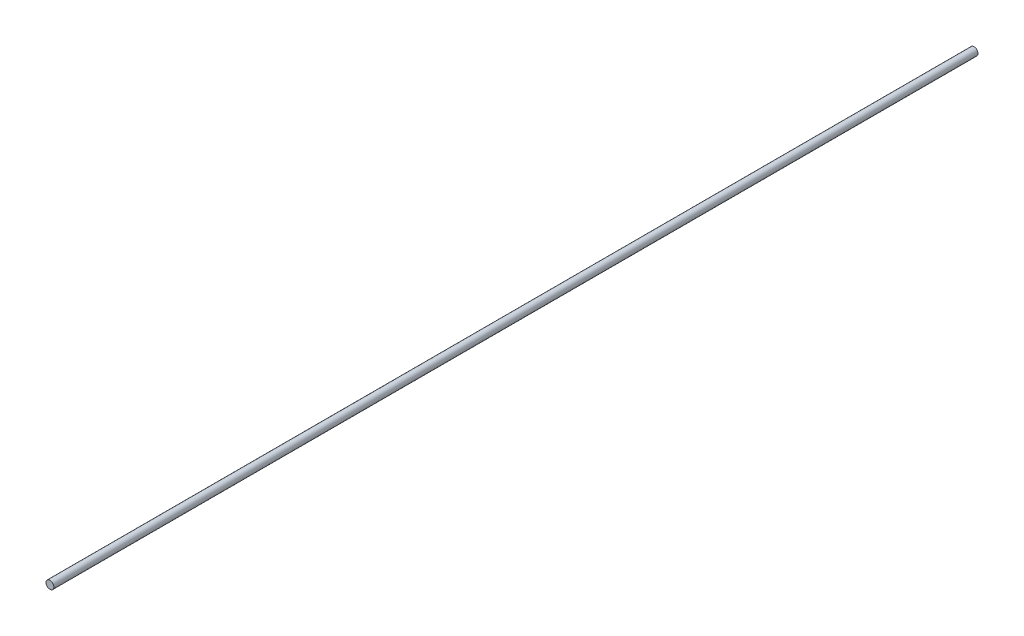
ISO-10303-21;
HEADER;
FILE_DESCRIPTION(('STEP AP214'),'2;1');
FILE_NAME('part.step','',(''),(''),'','','');
FILE_SCHEMA(('AUTOMOTIVE_DESIGN { 1 0 10303 214 1 1 1 1 }'));
ENDSEC;
DATA;
#1=APPLICATION_CONTEXT('core data for automotive mechanical design processes');
#2=APPLICATION_PROTOCOL_DEFINITION('international standard','automotive_design',2000,#1);
#3=PRODUCT_CONTEXT('',#1,'mechanical');
#4=PRODUCT('Part','Part','',(#3));
#5=PRODUCT_RELATED_PRODUCT_CATEGORY('part','',(#4));
#6=PRODUCT_DEFINITION_FORMATION('','',#4);
#7=PRODUCT_DEFINITION_CONTEXT('part definition',#1,'design');
#8=PRODUCT_DEFINITION('design','',#6,#7);
#9=PRODUCT_DEFINITION_SHAPE('','',#8);
#10=(LENGTH_UNIT() NAMED_UNIT(*) SI_UNIT(.MILLI.,.METRE.));
#11=(NAMED_UNIT(*) PLANE_ANGLE_UNIT() SI_UNIT($,.RADIAN.));
#12=(NAMED_UNIT(*) SI_UNIT($,.STERADIAN.) SOLID_ANGLE_UNIT());
#13=UNCERTAINTY_MEASURE_WITH_UNIT(LENGTH_MEASURE(1.E-05),#10,'distance_accuracy_value','');
#14=(GEOMETRIC_REPRESENTATION_CONTEXT(3) GLOBAL_UNCERTAINTY_ASSIGNED_CONTEXT((#13)) GLOBAL_UNIT_ASSIGNED_CONTEXT((#10,
#11,#12)) REPRESENTATION_CONTEXT('',''));
#15=CARTESIAN_POINT('',(0.,0.,0.));
#16=DIRECTION('',(0.,0.,1.));
#17=DIRECTION('',(1.,0.,0.));
#18=AXIS2_PLACEMENT_3D('',#15,#16,#17);
#19=CARTESIAN_POINT('',(0.,0.,2094.656901781));
#20=DIRECTION('',(0.,0.,-1.));
#21=DIRECTION('',(-1.,0.,0.));
#22=AXIS2_PLACEMENT_3D('',#19,#20,#21);
#23=CYLINDRICAL_SURFACE('',#22,8.89);
#24=CARTESIAN_POINT('',(0.,0.,2094.656901781));
#25=DIRECTION('',(0.,0.,1.));
#26=DIRECTION('',(1.,0.,0.));
#27=AXIS2_PLACEMENT_3D('',#24,#25,#26);
#28=CIRCLE('',#27,8.89);
#29=CARTESIAN_POINT('',(8.89,0.,2094.656901781));
#30=VERTEX_POINT('',#29);
#31=EDGE_CURVE('E10',#30,#30,#28,.T.);
#32=ORIENTED_EDGE('',*,*,#31,.F.);
#33=EDGE_LOOP('',(#32));
#34=FACE_BOUND('',#33,.T.);
#35=CARTESIAN_POINT('',(0.,0.,0.));
#36=DIRECTION('',(0.,0.,1.));
#37=DIRECTION('',(1.,0.,0.));
#38=AXIS2_PLACEMENT_3D('',#35,#36,#37);
#39=CIRCLE('',#38,8.89);
#40=CARTESIAN_POINT('',(8.89,0.,0.));
#41=VERTEX_POINT('',#40);
#42=EDGE_CURVE('E44',#41,#41,#39,.T.);
#43=ORIENTED_EDGE('',*,*,#42,.T.);
#44=EDGE_LOOP('',(#43));
#45=FACE_BOUND('',#44,.T.);
#46=ADVANCED_FACE('F41',(#34,#45),#23,.T.);
#47=CARTESIAN_POINT('',(0.,0.,2094.656901781));
#48=DIRECTION('',(0.,0.,1.));
#49=DIRECTION('',(1.,0.,0.));
#50=AXIS2_PLACEMENT_3D('',#47,#48,#49);
#51=PLANE('',#50);
#52=ORIENTED_EDGE('',*,*,#31,.T.);
#53=EDGE_LOOP('',(#52));
#54=FACE_BOUND('',#53,.T.);
#55=ADVANCED_FACE('F56',(#54),#51,.T.);
#56=CARTESIAN_POINT('',(0.,0.,0.));
#57=DIRECTION('',(0.,0.,1.));
#58=DIRECTION('',(1.,0.,0.));
#59=AXIS2_PLACEMENT_3D('',#56,#57,#58);
#60=PLANE('',#59);
#61=ORIENTED_EDGE('',*,*,#42,.F.);
#62=EDGE_LOOP('',(#61));
#63=FACE_BOUND('',#62,.T.);
#64=ADVANCED_FACE('F54',(#63),#60,.F.);
#65=CLOSED_SHELL('',(#46,#55,#64));
#66=MANIFOLD_SOLID_BREP('B2',#65);
#67=ADVANCED_BREP_SHAPE_REPRESENTATION('',(#18,#66),#14);
#68=SHAPE_DEFINITION_REPRESENTATION(#9,#67);
ENDSEC;
END-ISO-10303-21;
